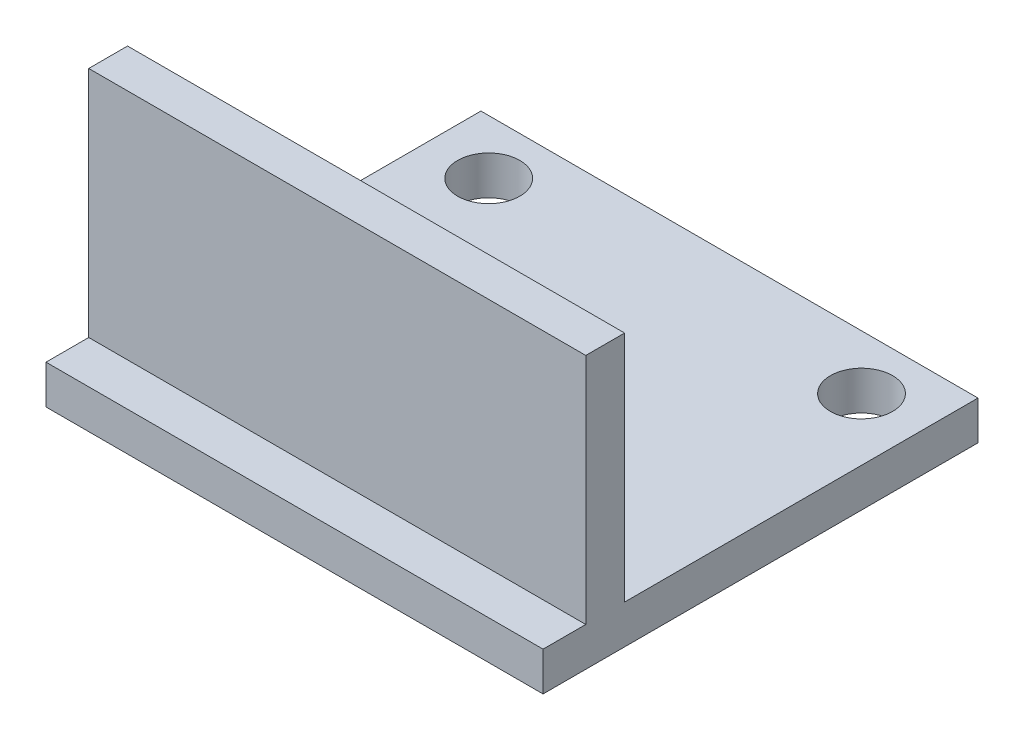
ISO-10303-21;
HEADER;
FILE_DESCRIPTION(('STEP AP214'),'2;1');
FILE_NAME('part.step','',(''),(''),'','','');
FILE_SCHEMA(('AUTOMOTIVE_DESIGN { 1 0 10303 214 1 1 1 1 }'));
ENDSEC;
DATA;
#1=APPLICATION_CONTEXT('core data for automotive mechanical design processes');
#2=APPLICATION_PROTOCOL_DEFINITION('international standard','automotive_design',2000,#1);
#3=PRODUCT_CONTEXT('',#1,'mechanical');
#4=PRODUCT('Part','Part','',(#3));
#5=PRODUCT_RELATED_PRODUCT_CATEGORY('part','',(#4));
#6=PRODUCT_DEFINITION_FORMATION('','',#4);
#7=PRODUCT_DEFINITION_CONTEXT('part definition',#1,'design');
#8=PRODUCT_DEFINITION('design','',#6,#7);
#9=PRODUCT_DEFINITION_SHAPE('','',#8);
#10=(LENGTH_UNIT() NAMED_UNIT(*) SI_UNIT(.MILLI.,.METRE.));
#11=(NAMED_UNIT(*) PLANE_ANGLE_UNIT() SI_UNIT($,.RADIAN.));
#12=(NAMED_UNIT(*) SI_UNIT($,.STERADIAN.) SOLID_ANGLE_UNIT());
#13=UNCERTAINTY_MEASURE_WITH_UNIT(LENGTH_MEASURE(1.E-05),#10,'distance_accuracy_value','');
#14=(GEOMETRIC_REPRESENTATION_CONTEXT(3) GLOBAL_UNCERTAINTY_ASSIGNED_CONTEXT((#13)) GLOBAL_UNIT_ASSIGNED_CONTEXT((#10,
#11,#12)) REPRESENTATION_CONTEXT('',''));
#15=CARTESIAN_POINT('',(0.,0.,0.));
#16=DIRECTION('',(0.,0.,1.));
#17=DIRECTION('',(1.,0.,0.));
#18=AXIS2_PLACEMENT_3D('',#15,#16,#17);
#19=CARTESIAN_POINT('',(0.,1.5875,0.));
#20=DIRECTION('',(0.,-1.,0.));
#21=DIRECTION('',(0.,0.,-1.));
#22=AXIS2_PLACEMENT_3D('',#19,#20,#21);
#23=PLANE('',#22);
#24=CARTESIAN_POINT('',(7.61999999999999,1.5875,-6.6675));
#25=DIRECTION('',(0.,1.,0.));
#26=DIRECTION('',(0.,0.,-1.));
#27=AXIS2_PLACEMENT_3D('',#24,#25,#26);
#28=CIRCLE('',#27,1.27);
#29=CARTESIAN_POINT('',(7.61999999999999,1.5875,-7.9375));
#30=VERTEX_POINT('',#29);
#31=EDGE_CURVE('E126',#30,#30,#28,.T.);
#32=ORIENTED_EDGE('',*,*,#31,.F.);
#33=EDGE_LOOP('',(#32));
#34=FACE_BOUND('',#33,.T.);
#35=CARTESIAN_POINT('',(-7.62,1.5875,-6.66749999999999));
#36=DIRECTION('',(0.,1.,0.));
#37=DIRECTION('',(0.,0.,1.));
#38=AXIS2_PLACEMENT_3D('',#35,#36,#37);
#39=CIRCLE('',#38,1.27);
#40=CARTESIAN_POINT('',(-7.62,1.5875,-5.39749999999999));
#41=VERTEX_POINT('',#40);
#42=EDGE_CURVE('E135',#41,#41,#39,.T.);
#43=ORIENTED_EDGE('',*,*,#42,.F.);
#44=EDGE_LOOP('',(#43));
#45=FACE_BOUND('',#44,.T.);
#46=DIRECTION('',(-1.,0.,0.));
#47=VECTOR('',#46,1.);
#48=CARTESIAN_POINT('',(10.16,1.5875,5.55625));
#49=LINE('',#48,#47);
#50=CARTESIAN_POINT('',(10.16,1.5875,5.55625));
#51=VERTEX_POINT('',#50);
#52=CARTESIAN_POINT('',(-10.16,1.5875,5.55625));
#53=VERTEX_POINT('',#52);
#54=EDGE_CURVE('E50',#51,#53,#49,.T.);
#55=ORIENTED_EDGE('',*,*,#54,.F.);
#56=DIRECTION('',(0.,0.,-1.));
#57=VECTOR('',#56,1.);
#58=CARTESIAN_POINT('',(10.16,1.5875,-8.89));
#59=LINE('',#58,#57);
#60=CARTESIAN_POINT('',(10.16,1.5875,-8.89));
#61=VERTEX_POINT('',#60);
#62=EDGE_CURVE('E145',#51,#61,#59,.T.);
#63=ORIENTED_EDGE('',*,*,#62,.T.);
#64=DIRECTION('',(-1.,0.,0.));
#65=VECTOR('',#64,1.);
#66=CARTESIAN_POINT('',(10.16,1.5875,-8.89));
#67=LINE('',#66,#65);
#68=CARTESIAN_POINT('',(-10.16,1.5875,-8.89));
#69=VERTEX_POINT('',#68);
#70=EDGE_CURVE('E148',#61,#69,#67,.T.);
#71=ORIENTED_EDGE('',*,*,#70,.T.);
#72=DIRECTION('',(0.,0.,1.));
#73=VECTOR('',#72,1.);
#74=CARTESIAN_POINT('',(-10.16,1.5875,-8.89));
#75=LINE('',#74,#73);
#76=EDGE_CURVE('E141',#69,#53,#75,.T.);
#77=ORIENTED_EDGE('',*,*,#76,.T.);
#78=EDGE_LOOP('',(#55,#63,#71,#77));
#79=FACE_BOUND('',#78,.T.);
#80=ADVANCED_FACE('F35',(#34,#45,#79),#23,.F.);
#81=DIRECTION('',(1.,0.,0.));
#82=VECTOR('',#81,1.);
#83=CARTESIAN_POINT('',(10.16,1.5875,7.14375));
#84=LINE('',#83,#82);
#85=CARTESIAN_POINT('',(-10.16,1.5875,7.14375));
#86=VERTEX_POINT('',#85);
#87=CARTESIAN_POINT('',(10.16,1.5875,7.14375));
#88=VERTEX_POINT('',#87);
#89=EDGE_CURVE('E58',#86,#88,#84,.T.);
#90=ORIENTED_EDGE('',*,*,#89,.F.);
#91=CARTESIAN_POINT('',(-10.16,1.5875,8.89));
#92=VERTEX_POINT('',#91);
#93=EDGE_CURVE('E122',#86,#92,#75,.T.);
#94=ORIENTED_EDGE('',*,*,#93,.T.);
#95=DIRECTION('',(1.,0.,0.));
#96=VECTOR('',#95,1.);
#97=CARTESIAN_POINT('',(10.16,1.5875,8.89));
#98=LINE('',#97,#96);
#99=CARTESIAN_POINT('',(10.16,1.5875,8.89));
#100=VERTEX_POINT('',#99);
#101=EDGE_CURVE('E143',#92,#100,#98,.T.);
#102=ORIENTED_EDGE('',*,*,#101,.T.);
#103=EDGE_CURVE('E146',#100,#88,#59,.T.);
#104=ORIENTED_EDGE('',*,*,#103,.T.);
#105=EDGE_LOOP('',(#90,#94,#102,#104));
#106=FACE_BOUND('',#105,.T.);
#107=ADVANCED_FACE('F201',(#106),#23,.F.);
#108=CARTESIAN_POINT('',(0.,0.,0.));
#109=DIRECTION('',(0.,-1.,0.));
#110=DIRECTION('',(0.,0.,-1.));
#111=AXIS2_PLACEMENT_3D('',#108,#109,#110);
#112=PLANE('',#111);
#113=CARTESIAN_POINT('',(-7.62,0.,-6.66749999999999));
#114=DIRECTION('',(0.,1.,0.));
#115=DIRECTION('',(0.,0.,1.));
#116=AXIS2_PLACEMENT_3D('',#113,#114,#115);
#117=CIRCLE('',#116,1.27);
#118=CARTESIAN_POINT('',(-7.62,0.,-5.39749999999999));
#119=VERTEX_POINT('',#118);
#120=EDGE_CURVE('E133',#119,#119,#117,.T.);
#121=ORIENTED_EDGE('',*,*,#120,.T.);
#122=EDGE_LOOP('',(#121));
#123=FACE_BOUND('',#122,.T.);
#124=DIRECTION('',(0.,0.,1.));
#125=VECTOR('',#124,1.);
#126=CARTESIAN_POINT('',(-10.16,0.,-8.89));
#127=LINE('',#126,#125);
#128=CARTESIAN_POINT('',(-10.16,0.,-8.89));
#129=VERTEX_POINT('',#128);
#130=CARTESIAN_POINT('',(-10.16,0.,8.89));
#131=VERTEX_POINT('',#130);
#132=EDGE_CURVE('E138',#129,#131,#127,.T.);
#133=ORIENTED_EDGE('',*,*,#132,.F.);
#134=DIRECTION('',(-1.,0.,0.));
#135=VECTOR('',#134,1.);
#136=CARTESIAN_POINT('',(10.16,0.,-8.89));
#137=LINE('',#136,#135);
#138=CARTESIAN_POINT('',(10.16,0.,-8.89));
#139=VERTEX_POINT('',#138);
#140=EDGE_CURVE('E156',#139,#129,#137,.T.);
#141=ORIENTED_EDGE('',*,*,#140,.F.);
#142=DIRECTION('',(0.,0.,-1.));
#143=VECTOR('',#142,1.);
#144=CARTESIAN_POINT('',(10.16,0.,-8.89));
#145=LINE('',#144,#143);
#146=CARTESIAN_POINT('',(10.16,0.,8.89));
#147=VERTEX_POINT('',#146);
#148=EDGE_CURVE('E154',#147,#139,#145,.T.);
#149=ORIENTED_EDGE('',*,*,#148,.F.);
#150=DIRECTION('',(1.,0.,0.));
#151=VECTOR('',#150,1.);
#152=CARTESIAN_POINT('',(10.16,0.,8.89));
#153=LINE('',#152,#151);
#154=EDGE_CURVE('E152',#131,#147,#153,.T.);
#155=ORIENTED_EDGE('',*,*,#154,.F.);
#156=EDGE_LOOP('',(#133,#141,#149,#155));
#157=FACE_BOUND('',#156,.T.);
#158=CARTESIAN_POINT('',(7.61999999999999,0.,-6.6675));
#159=DIRECTION('',(0.,1.,0.));
#160=DIRECTION('',(0.,0.,-1.));
#161=AXIS2_PLACEMENT_3D('',#158,#159,#160);
#162=CIRCLE('',#161,1.27);
#163=CARTESIAN_POINT('',(7.61999999999999,0.,-7.9375));
#164=VERTEX_POINT('',#163);
#165=EDGE_CURVE('E123',#164,#164,#162,.T.);
#166=ORIENTED_EDGE('',*,*,#165,.T.);
#167=EDGE_LOOP('',(#166));
#168=FACE_BOUND('',#167,.T.);
#169=ADVANCED_FACE('F174',(#123,#157,#168),#112,.T.);
#170=CARTESIAN_POINT('',(-10.16,1.5875,-8.89));
#171=DIRECTION('',(1.,0.,0.));
#172=DIRECTION('',(0.,0.,-1.));
#173=AXIS2_PLACEMENT_3D('',#170,#171,#172);
#174=PLANE('',#173);
#175=ORIENTED_EDGE('',*,*,#132,.T.);
#176=DIRECTION('',(0.,-1.,0.));
#177=VECTOR('',#176,1.);
#178=CARTESIAN_POINT('',(-10.16,1.5875,8.89));
#179=LINE('',#178,#177);
#180=EDGE_CURVE('E11',#92,#131,#179,.T.);
#181=ORIENTED_EDGE('',*,*,#180,.F.);
#182=ORIENTED_EDGE('',*,*,#93,.F.);
#183=DIRECTION('',(0.,-1.,0.));
#184=VECTOR('',#183,1.);
#185=CARTESIAN_POINT('',(-10.16,11.1125,7.14375));
#186=LINE('',#185,#184);
#187=CARTESIAN_POINT('',(-10.16,11.1125,7.14375));
#188=VERTEX_POINT('',#187);
#189=EDGE_CURVE('E104',#188,#86,#186,.T.);
#190=ORIENTED_EDGE('',*,*,#189,.F.);
#191=DIRECTION('',(0.,0.,1.));
#192=VECTOR('',#191,1.);
#193=CARTESIAN_POINT('',(-10.16,11.1125,5.55625));
#194=LINE('',#193,#192);
#195=CARTESIAN_POINT('',(-10.16,11.1125,5.55625));
#196=VERTEX_POINT('',#195);
#197=EDGE_CURVE('E110',#196,#188,#194,.T.);
#198=ORIENTED_EDGE('',*,*,#197,.F.);
#199=DIRECTION('',(0.,-1.,0.));
#200=VECTOR('',#199,1.);
#201=CARTESIAN_POINT('',(-10.16,11.1125,5.55625));
#202=LINE('',#201,#200);
#203=EDGE_CURVE('E181',#196,#53,#202,.T.);
#204=ORIENTED_EDGE('',*,*,#203,.T.);
#205=ORIENTED_EDGE('',*,*,#76,.F.);
#206=DIRECTION('',(0.,-1.,0.));
#207=VECTOR('',#206,1.);
#208=CARTESIAN_POINT('',(-10.16,1.5875,-8.89));
#209=LINE('',#208,#207);
#210=EDGE_CURVE('E150',#69,#129,#209,.T.);
#211=ORIENTED_EDGE('',*,*,#210,.T.);
#212=EDGE_LOOP('',(#175,#181,#182,#190,#198,#204,#205,#211));
#213=FACE_BOUND('',#212,.T.);
#214=ADVANCED_FACE('F37',(#213),#174,.F.);
#215=CARTESIAN_POINT('',(10.16,1.5875,8.89));
#216=DIRECTION('',(0.,0.,-1.));
#217=DIRECTION('',(-1.,0.,0.));
#218=AXIS2_PLACEMENT_3D('',#215,#216,#217);
#219=PLANE('',#218);
#220=ORIENTED_EDGE('',*,*,#154,.T.);
#221=DIRECTION('',(0.,-1.,0.));
#222=VECTOR('',#221,1.);
#223=CARTESIAN_POINT('',(10.16,1.5875,8.89));
#224=LINE('',#223,#222);
#225=EDGE_CURVE('E43',#100,#147,#224,.T.);
#226=ORIENTED_EDGE('',*,*,#225,.F.);
#227=ORIENTED_EDGE('',*,*,#101,.F.);
#228=ORIENTED_EDGE('',*,*,#180,.T.);
#229=EDGE_LOOP('',(#220,#226,#227,#228));
#230=FACE_BOUND('',#229,.T.);
#231=ADVANCED_FACE('F219',(#230),#219,.F.);
#232=CARTESIAN_POINT('',(10.16,1.5875,-8.89));
#233=DIRECTION('',(-1.,0.,0.));
#234=DIRECTION('',(0.,0.,1.));
#235=AXIS2_PLACEMENT_3D('',#232,#233,#234);
#236=PLANE('',#235);
#237=ORIENTED_EDGE('',*,*,#148,.T.);
#238=DIRECTION('',(0.,-1.,0.));
#239=VECTOR('',#238,1.);
#240=CARTESIAN_POINT('',(10.16,1.5875,-8.89));
#241=LINE('',#240,#239);
#242=EDGE_CURVE('E160',#61,#139,#241,.T.);
#243=ORIENTED_EDGE('',*,*,#242,.F.);
#244=ORIENTED_EDGE('',*,*,#62,.F.);
#245=DIRECTION('',(0.,-1.,0.));
#246=VECTOR('',#245,1.);
#247=CARTESIAN_POINT('',(10.16,11.1125,5.55625));
#248=LINE('',#247,#246);
#249=CARTESIAN_POINT('',(10.16,11.1125,5.55625));
#250=VERTEX_POINT('',#249);
#251=EDGE_CURVE('E128',#250,#51,#248,.T.);
#252=ORIENTED_EDGE('',*,*,#251,.F.);
#253=DIRECTION('',(0.,0.,-1.));
#254=VECTOR('',#253,1.);
#255=CARTESIAN_POINT('',(10.16,11.1125,5.55625));
#256=LINE('',#255,#254);
#257=CARTESIAN_POINT('',(10.16,11.1125,7.14375));
#258=VERTEX_POINT('',#257);
#259=EDGE_CURVE('E109',#258,#250,#256,.T.);
#260=ORIENTED_EDGE('',*,*,#259,.F.);
#261=DIRECTION('',(0.,-1.,0.));
#262=VECTOR('',#261,1.);
#263=CARTESIAN_POINT('',(10.16,11.1125,7.14375));
#264=LINE('',#263,#262);
#265=EDGE_CURVE('E106',#258,#88,#264,.T.);
#266=ORIENTED_EDGE('',*,*,#265,.T.);
#267=ORIENTED_EDGE('',*,*,#103,.F.);
#268=ORIENTED_EDGE('',*,*,#225,.T.);
#269=EDGE_LOOP('',(#237,#243,#244,#252,#260,#266,#267,#268));
#270=FACE_BOUND('',#269,.T.);
#271=ADVANCED_FACE('F167',(#270),#236,.F.);
#272=CARTESIAN_POINT('',(10.16,1.5875,-8.89));
#273=DIRECTION('',(0.,0.,1.));
#274=DIRECTION('',(1.,0.,0.));
#275=AXIS2_PLACEMENT_3D('',#272,#273,#274);
#276=PLANE('',#275);
#277=ORIENTED_EDGE('',*,*,#140,.T.);
#278=ORIENTED_EDGE('',*,*,#210,.F.);
#279=ORIENTED_EDGE('',*,*,#70,.F.);
#280=ORIENTED_EDGE('',*,*,#242,.T.);
#281=EDGE_LOOP('',(#277,#278,#279,#280));
#282=FACE_BOUND('',#281,.T.);
#283=ADVANCED_FACE('F178',(#282),#276,.F.);
#284=CARTESIAN_POINT('',(-7.62,1.5875,-6.66749999999999));
#285=DIRECTION('',(0.,-1.,0.));
#286=DIRECTION('',(0.,0.,-1.));
#287=AXIS2_PLACEMENT_3D('',#284,#285,#286);
#288=CYLINDRICAL_SURFACE('',#287,1.27);
#289=ORIENTED_EDGE('',*,*,#42,.T.);
#290=EDGE_LOOP('',(#289));
#291=FACE_BOUND('',#290,.T.);
#292=ORIENTED_EDGE('',*,*,#120,.F.);
#293=EDGE_LOOP('',(#292));
#294=FACE_BOUND('',#293,.T.);
#295=ADVANCED_FACE('F211',(#291,#294),#288,.F.);
#296=CARTESIAN_POINT('',(7.61999999999999,1.5875,-6.6675));
#297=DIRECTION('',(0.,-1.,0.));
#298=DIRECTION('',(0.,0.,-1.));
#299=AXIS2_PLACEMENT_3D('',#296,#297,#298);
#300=CYLINDRICAL_SURFACE('',#299,1.27);
#301=ORIENTED_EDGE('',*,*,#31,.T.);
#302=EDGE_LOOP('',(#301));
#303=FACE_BOUND('',#302,.T.);
#304=ORIENTED_EDGE('',*,*,#165,.F.);
#305=EDGE_LOOP('',(#304));
#306=FACE_BOUND('',#305,.T.);
#307=ADVANCED_FACE('F198',(#303,#306),#300,.F.);
#308=CARTESIAN_POINT('',(10.16,11.1125,7.14375));
#309=DIRECTION('',(0.,0.,-1.));
#310=DIRECTION('',(-1.,0.,0.));
#311=AXIS2_PLACEMENT_3D('',#308,#309,#310);
#312=PLANE('',#311);
#313=ORIENTED_EDGE('',*,*,#89,.T.);
#314=ORIENTED_EDGE('',*,*,#265,.F.);
#315=DIRECTION('',(1.,0.,0.));
#316=VECTOR('',#315,1.);
#317=CARTESIAN_POINT('',(10.16,11.1125,7.14375));
#318=LINE('',#317,#316);
#319=EDGE_CURVE('E100',#188,#258,#318,.T.);
#320=ORIENTED_EDGE('',*,*,#319,.F.);
#321=ORIENTED_EDGE('',*,*,#189,.T.);
#322=EDGE_LOOP('',(#313,#314,#320,#321));
#323=FACE_BOUND('',#322,.T.);
#324=ADVANCED_FACE('F102',(#323),#312,.F.);
#325=CARTESIAN_POINT('',(10.16,11.1125,5.55625));
#326=DIRECTION('',(0.,0.,1.));
#327=DIRECTION('',(1.,0.,0.));
#328=AXIS2_PLACEMENT_3D('',#325,#326,#327);
#329=PLANE('',#328);
#330=ORIENTED_EDGE('',*,*,#54,.T.);
#331=ORIENTED_EDGE('',*,*,#203,.F.);
#332=DIRECTION('',(-1.,0.,0.));
#333=VECTOR('',#332,1.);
#334=CARTESIAN_POINT('',(10.16,11.1125,5.55625));
#335=LINE('',#334,#333);
#336=EDGE_CURVE('E115',#250,#196,#335,.T.);
#337=ORIENTED_EDGE('',*,*,#336,.F.);
#338=ORIENTED_EDGE('',*,*,#251,.T.);
#339=EDGE_LOOP('',(#330,#331,#337,#338));
#340=FACE_BOUND('',#339,.T.);
#341=ADVANCED_FACE('F184',(#340),#329,.F.);
#342=CARTESIAN_POINT('',(0.,11.1125,0.));
#343=DIRECTION('',(0.,-1.,0.));
#344=DIRECTION('',(0.,0.,-1.));
#345=AXIS2_PLACEMENT_3D('',#342,#343,#344);
#346=PLANE('',#345);
#347=ORIENTED_EDGE('',*,*,#197,.T.);
#348=ORIENTED_EDGE('',*,*,#319,.T.);
#349=ORIENTED_EDGE('',*,*,#259,.T.);
#350=ORIENTED_EDGE('',*,*,#336,.T.);
#351=EDGE_LOOP('',(#347,#348,#349,#350));
#352=FACE_BOUND('',#351,.T.);
#353=ADVANCED_FACE('F113',(#352),#346,.F.);
#354=CLOSED_SHELL('',(#80,#107,#169,#214,#231,#271,#283,#295,#307,#324,#341,#353));
#355=MANIFOLD_SOLID_BREP('B2',#354);
#356=ADVANCED_BREP_SHAPE_REPRESENTATION('',(#18,#355),#14);
#357=SHAPE_DEFINITION_REPRESENTATION(#9,#356);
ENDSEC;
END-ISO-10303-21;
